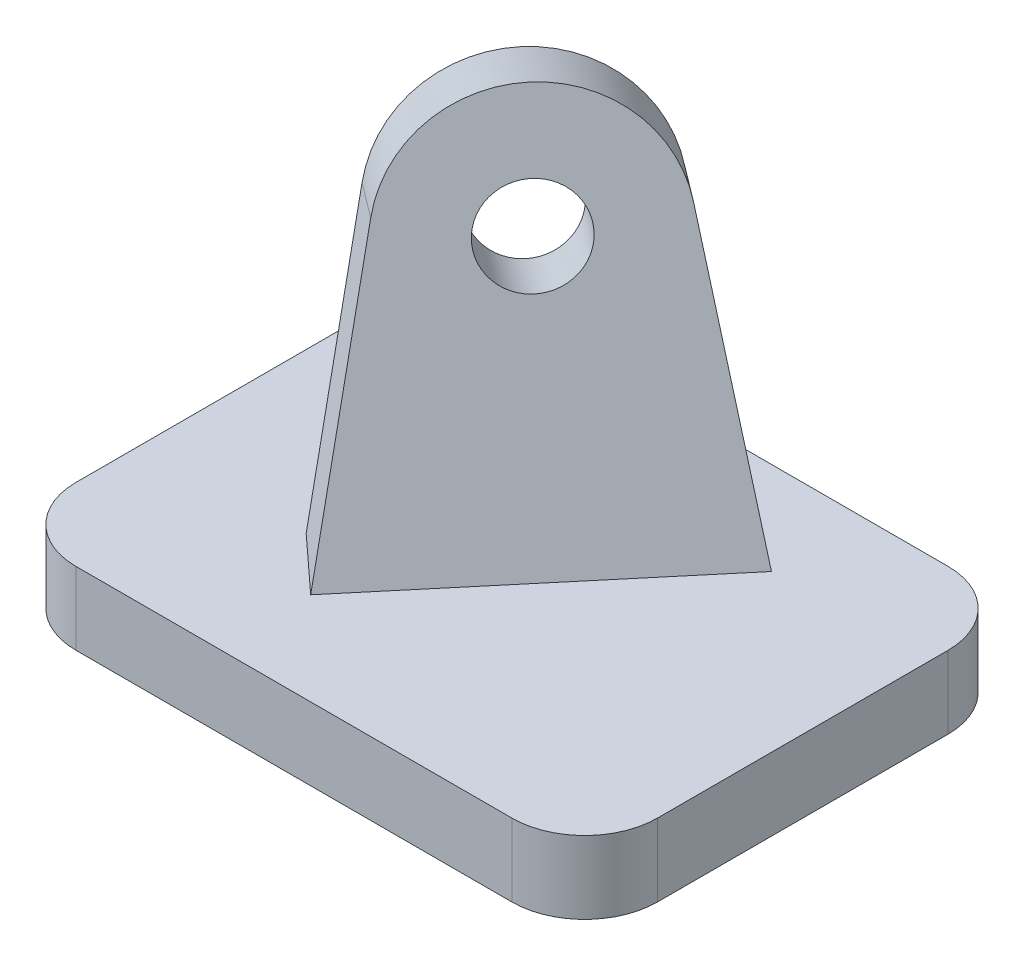
ISO-10303-21;
HEADER;
FILE_DESCRIPTION(('STEP AP214'),'2;1');
FILE_NAME('part.step','',(''),(''),'','','');
FILE_SCHEMA(('AUTOMOTIVE_DESIGN { 1 0 10303 214 1 1 1 1 }'));
ENDSEC;
DATA;
#1=APPLICATION_CONTEXT('core data for automotive mechanical design processes');
#2=APPLICATION_PROTOCOL_DEFINITION('international standard','automotive_design',2000,#1);
#3=PRODUCT_CONTEXT('',#1,'mechanical');
#4=PRODUCT('Part','Part','',(#3));
#5=PRODUCT_RELATED_PRODUCT_CATEGORY('part','',(#4));
#6=PRODUCT_DEFINITION_FORMATION('','',#4);
#7=PRODUCT_DEFINITION_CONTEXT('part definition',#1,'design');
#8=PRODUCT_DEFINITION('design','',#6,#7);
#9=PRODUCT_DEFINITION_SHAPE('','',#8);
#10=(LENGTH_UNIT() NAMED_UNIT(*) SI_UNIT(.MILLI.,.METRE.));
#11=(NAMED_UNIT(*) PLANE_ANGLE_UNIT() SI_UNIT($,.RADIAN.));
#12=(NAMED_UNIT(*) SI_UNIT($,.STERADIAN.) SOLID_ANGLE_UNIT());
#13=UNCERTAINTY_MEASURE_WITH_UNIT(LENGTH_MEASURE(1.E-05),#10,'distance_accuracy_value','');
#14=(GEOMETRIC_REPRESENTATION_CONTEXT(3) GLOBAL_UNCERTAINTY_ASSIGNED_CONTEXT((#13)) GLOBAL_UNIT_ASSIGNED_CONTEXT((#10,
#11,#12)) REPRESENTATION_CONTEXT('',''));
#15=CARTESIAN_POINT('',(0.,0.,0.));
#16=DIRECTION('',(0.,0.,1.));
#17=DIRECTION('',(1.,0.,0.));
#18=AXIS2_PLACEMENT_3D('',#15,#16,#17);
#19=CARTESIAN_POINT('',(30.,10.,-20.));
#20=DIRECTION('',(0.,-1.,0.));
#21=DIRECTION('',(0.,0.,-1.));
#22=AXIS2_PLACEMENT_3D('',#19,#20,#21);
#23=CYLINDRICAL_SURFACE('',#22,10.);
#24=CARTESIAN_POINT('',(30.,0.,-20.));
#25=DIRECTION('',(0.,1.,0.));
#26=DIRECTION('',(0.,0.,-1.));
#27=AXIS2_PLACEMENT_3D('',#24,#25,#26);
#28=CIRCLE('',#27,10.);
#29=CARTESIAN_POINT('',(40.,0.,-19.9999999999999));
#30=VERTEX_POINT('',#29);
#31=CARTESIAN_POINT('',(29.9999999999999,0.,-30.));
#32=VERTEX_POINT('',#31);
#33=EDGE_CURVE('E159',#30,#32,#28,.T.);
#34=ORIENTED_EDGE('',*,*,#33,.T.);
#35=DIRECTION('',(0.,-1.,0.));
#36=VECTOR('',#35,1.);
#37=CARTESIAN_POINT('',(29.9999999999999,10.,-30.));
#38=LINE('',#37,#36);
#39=CARTESIAN_POINT('',(29.9999999999999,10.,-30.));
#40=VERTEX_POINT('',#39);
#41=EDGE_CURVE('E215',#40,#32,#38,.T.);
#42=ORIENTED_EDGE('',*,*,#41,.F.);
#43=CARTESIAN_POINT('',(30.,10.,-20.));
#44=DIRECTION('',(0.,1.,0.));
#45=DIRECTION('',(0.,0.,-1.));
#46=AXIS2_PLACEMENT_3D('',#43,#44,#45);
#47=CIRCLE('',#46,10.);
#48=CARTESIAN_POINT('',(40.,10.,-19.9999999999999));
#49=VERTEX_POINT('',#48);
#50=EDGE_CURVE('E161',#49,#40,#47,.T.);
#51=ORIENTED_EDGE('',*,*,#50,.F.);
#52=DIRECTION('',(0.,-1.,0.));
#53=VECTOR('',#52,1.);
#54=CARTESIAN_POINT('',(40.,10.,-19.9999999999999));
#55=LINE('',#54,#53);
#56=EDGE_CURVE('E179',#49,#30,#55,.T.);
#57=ORIENTED_EDGE('',*,*,#56,.T.);
#58=EDGE_LOOP('',(#34,#42,#51,#57));
#59=FACE_BOUND('',#58,.T.);
#60=ADVANCED_FACE('F41',(#59),#23,.T.);
#61=CARTESIAN_POINT('',(-29.9999999999999,10.,-30.));
#62=DIRECTION('',(0.,0.,1.));
#63=DIRECTION('',(1.,0.,0.));
#64=AXIS2_PLACEMENT_3D('',#61,#62,#63);
#65=PLANE('',#64);
#66=DIRECTION('',(-1.,0.,0.));
#67=VECTOR('',#66,1.);
#68=CARTESIAN_POINT('',(-29.9999999999999,0.,-30.));
#69=LINE('',#68,#67);
#70=CARTESIAN_POINT('',(-29.9999999999999,0.,-30.));
#71=VERTEX_POINT('',#70);
#72=EDGE_CURVE('E182',#32,#71,#69,.T.);
#73=ORIENTED_EDGE('',*,*,#72,.T.);
#74=DIRECTION('',(0.,-1.,0.));
#75=VECTOR('',#74,1.);
#76=CARTESIAN_POINT('',(-29.9999999999999,10.,-30.));
#77=LINE('',#76,#75);
#78=CARTESIAN_POINT('',(-29.9999999999999,10.,-30.));
#79=VERTEX_POINT('',#78);
#80=EDGE_CURVE('E212',#79,#71,#77,.T.);
#81=ORIENTED_EDGE('',*,*,#80,.F.);
#82=DIRECTION('',(-1.,0.,0.));
#83=VECTOR('',#82,1.);
#84=CARTESIAN_POINT('',(-29.9999999999999,10.,-30.));
#85=LINE('',#84,#83);
#86=EDGE_CURVE('E164',#40,#79,#85,.T.);
#87=ORIENTED_EDGE('',*,*,#86,.F.);
#88=ORIENTED_EDGE('',*,*,#41,.T.);
#89=EDGE_LOOP('',(#73,#81,#87,#88));
#90=FACE_BOUND('',#89,.T.);
#91=ADVANCED_FACE('F247',(#90),#65,.F.);
#92=CARTESIAN_POINT('',(-30.,10.,-20.));
#93=DIRECTION('',(0.,-1.,0.));
#94=DIRECTION('',(0.,0.,-1.));
#95=AXIS2_PLACEMENT_3D('',#92,#93,#94);
#96=CYLINDRICAL_SURFACE('',#95,10.);
#97=CARTESIAN_POINT('',(-30.,0.,-20.));
#98=DIRECTION('',(0.,1.,0.));
#99=DIRECTION('',(0.,0.,1.));
#100=AXIS2_PLACEMENT_3D('',#97,#98,#99);
#101=CIRCLE('',#100,10.);
#102=CARTESIAN_POINT('',(-40.,0.,-19.9999999999999));
#103=VERTEX_POINT('',#102);
#104=EDGE_CURVE('E184',#71,#103,#101,.T.);
#105=ORIENTED_EDGE('',*,*,#104,.T.);
#106=DIRECTION('',(0.,-1.,0.));
#107=VECTOR('',#106,1.);
#108=CARTESIAN_POINT('',(-40.,10.,-19.9999999999999));
#109=LINE('',#108,#107);
#110=CARTESIAN_POINT('',(-40.,10.,-19.9999999999999));
#111=VERTEX_POINT('',#110);
#112=EDGE_CURVE('E209',#111,#103,#109,.T.);
#113=ORIENTED_EDGE('',*,*,#112,.F.);
#114=CARTESIAN_POINT('',(-30.,10.,-20.));
#115=DIRECTION('',(0.,1.,0.));
#116=DIRECTION('',(0.,0.,1.));
#117=AXIS2_PLACEMENT_3D('',#114,#115,#116);
#118=CIRCLE('',#117,10.);
#119=EDGE_CURVE('E167',#79,#111,#118,.T.);
#120=ORIENTED_EDGE('',*,*,#119,.F.);
#121=ORIENTED_EDGE('',*,*,#80,.T.);
#122=EDGE_LOOP('',(#105,#113,#120,#121));
#123=FACE_BOUND('',#122,.T.);
#124=ADVANCED_FACE('F252',(#123),#96,.T.);
#125=CARTESIAN_POINT('',(-40.,10.,-19.9999999999999));
#126=DIRECTION('',(1.,0.,0.));
#127=DIRECTION('',(0.,0.,-1.));
#128=AXIS2_PLACEMENT_3D('',#125,#126,#127);
#129=PLANE('',#128);
#130=DIRECTION('',(0.,0.,1.));
#131=VECTOR('',#130,1.);
#132=CARTESIAN_POINT('',(-40.,0.,-19.9999999999999));
#133=LINE('',#132,#131);
#134=CARTESIAN_POINT('',(-40.,0.,19.9999999999999));
#135=VERTEX_POINT('',#134);
#136=EDGE_CURVE('E186',#103,#135,#133,.T.);
#137=ORIENTED_EDGE('',*,*,#136,.T.);
#138=DIRECTION('',(0.,-1.,0.));
#139=VECTOR('',#138,1.);
#140=CARTESIAN_POINT('',(-40.,10.,19.9999999999999));
#141=LINE('',#140,#139);
#142=CARTESIAN_POINT('',(-40.,10.,19.9999999999999));
#143=VERTEX_POINT('',#142);
#144=EDGE_CURVE('E206',#143,#135,#141,.T.);
#145=ORIENTED_EDGE('',*,*,#144,.F.);
#146=DIRECTION('',(0.,0.,1.));
#147=VECTOR('',#146,1.);
#148=CARTESIAN_POINT('',(-40.,10.,-19.9999999999999));
#149=LINE('',#148,#147);
#150=EDGE_CURVE('E169',#111,#143,#149,.T.);
#151=ORIENTED_EDGE('',*,*,#150,.F.);
#152=ORIENTED_EDGE('',*,*,#112,.T.);
#153=EDGE_LOOP('',(#137,#145,#151,#152));
#154=FACE_BOUND('',#153,.T.);
#155=ADVANCED_FACE('F286',(#154),#129,.F.);
#156=CARTESIAN_POINT('',(-30.,10.,20.));
#157=DIRECTION('',(0.,-1.,0.));
#158=DIRECTION('',(0.,0.,-1.));
#159=AXIS2_PLACEMENT_3D('',#156,#157,#158);
#160=CYLINDRICAL_SURFACE('',#159,10.);
#161=CARTESIAN_POINT('',(-30.,0.,20.));
#162=DIRECTION('',(0.,1.,0.));
#163=DIRECTION('',(0.,0.,1.));
#164=AXIS2_PLACEMENT_3D('',#161,#162,#163);
#165=CIRCLE('',#164,10.);
#166=CARTESIAN_POINT('',(-30.,0.,30.));
#167=VERTEX_POINT('',#166);
#168=EDGE_CURVE('E188',#135,#167,#165,.T.);
#169=ORIENTED_EDGE('',*,*,#168,.T.);
#170=DIRECTION('',(0.,-1.,0.));
#171=VECTOR('',#170,1.);
#172=CARTESIAN_POINT('',(-30.,10.,30.));
#173=LINE('',#172,#171);
#174=CARTESIAN_POINT('',(-30.,10.,30.));
#175=VERTEX_POINT('',#174);
#176=EDGE_CURVE('E203',#175,#167,#173,.T.);
#177=ORIENTED_EDGE('',*,*,#176,.F.);
#178=CARTESIAN_POINT('',(-30.,10.,20.));
#179=DIRECTION('',(0.,1.,0.));
#180=DIRECTION('',(0.,0.,1.));
#181=AXIS2_PLACEMENT_3D('',#178,#179,#180);
#182=CIRCLE('',#181,10.);
#183=EDGE_CURVE('E171',#143,#175,#182,.T.);
#184=ORIENTED_EDGE('',*,*,#183,.F.);
#185=ORIENTED_EDGE('',*,*,#144,.T.);
#186=EDGE_LOOP('',(#169,#177,#184,#185));
#187=FACE_BOUND('',#186,.T.);
#188=ADVANCED_FACE('F282',(#187),#160,.T.);
#189=CARTESIAN_POINT('',(-29.9999999999999,10.,30.));
#190=DIRECTION('',(0.,0.,-1.));
#191=DIRECTION('',(-1.,0.,0.));
#192=AXIS2_PLACEMENT_3D('',#189,#190,#191);
#193=PLANE('',#192);
#194=DIRECTION('',(1.,0.,0.));
#195=VECTOR('',#194,1.);
#196=CARTESIAN_POINT('',(-29.9999999999999,0.,30.));
#197=LINE('',#196,#195);
#198=CARTESIAN_POINT('',(29.9999999999999,0.,30.));
#199=VERTEX_POINT('',#198);
#200=EDGE_CURVE('E190',#167,#199,#197,.T.);
#201=ORIENTED_EDGE('',*,*,#200,.T.);
#202=DIRECTION('',(0.,-1.,0.));
#203=VECTOR('',#202,1.);
#204=CARTESIAN_POINT('',(29.9999999999999,10.,30.));
#205=LINE('',#204,#203);
#206=CARTESIAN_POINT('',(29.9999999999999,10.,30.));
#207=VERTEX_POINT('',#206);
#208=EDGE_CURVE('E200',#207,#199,#205,.T.);
#209=ORIENTED_EDGE('',*,*,#208,.F.);
#210=DIRECTION('',(1.,0.,0.));
#211=VECTOR('',#210,1.);
#212=CARTESIAN_POINT('',(-29.9999999999999,10.,30.));
#213=LINE('',#212,#211);
#214=EDGE_CURVE('E173',#175,#207,#213,.T.);
#215=ORIENTED_EDGE('',*,*,#214,.F.);
#216=ORIENTED_EDGE('',*,*,#176,.T.);
#217=EDGE_LOOP('',(#201,#209,#215,#216));
#218=FACE_BOUND('',#217,.T.);
#219=ADVANCED_FACE('F277',(#218),#193,.F.);
#220=CARTESIAN_POINT('',(30.,10.,20.));
#221=DIRECTION('',(0.,-1.,0.));
#222=DIRECTION('',(0.,0.,-1.));
#223=AXIS2_PLACEMENT_3D('',#220,#221,#222);
#224=CYLINDRICAL_SURFACE('',#223,10.);
#225=CARTESIAN_POINT('',(30.,0.,20.));
#226=DIRECTION('',(0.,1.,0.));
#227=DIRECTION('',(0.,0.,1.));
#228=AXIS2_PLACEMENT_3D('',#225,#226,#227);
#229=CIRCLE('',#228,10.);
#230=CARTESIAN_POINT('',(40.,0.,19.9999999999999));
#231=VERTEX_POINT('',#230);
#232=EDGE_CURVE('E192',#199,#231,#229,.T.);
#233=ORIENTED_EDGE('',*,*,#232,.T.);
#234=DIRECTION('',(0.,-1.,0.));
#235=VECTOR('',#234,1.);
#236=CARTESIAN_POINT('',(40.,10.,19.9999999999999));
#237=LINE('',#236,#235);
#238=CARTESIAN_POINT('',(40.,10.,19.9999999999999));
#239=VERTEX_POINT('',#238);
#240=EDGE_CURVE('E197',#239,#231,#237,.T.);
#241=ORIENTED_EDGE('',*,*,#240,.F.);
#242=CARTESIAN_POINT('',(30.,10.,20.));
#243=DIRECTION('',(0.,1.,0.));
#244=DIRECTION('',(0.,0.,1.));
#245=AXIS2_PLACEMENT_3D('',#242,#243,#244);
#246=CIRCLE('',#245,10.);
#247=EDGE_CURVE('E175',#207,#239,#246,.T.);
#248=ORIENTED_EDGE('',*,*,#247,.F.);
#249=ORIENTED_EDGE('',*,*,#208,.T.);
#250=EDGE_LOOP('',(#233,#241,#248,#249));
#251=FACE_BOUND('',#250,.T.);
#252=ADVANCED_FACE('F272',(#251),#224,.T.);
#253=CARTESIAN_POINT('',(40.,10.,-19.9999999999999));
#254=DIRECTION('',(-1.,0.,0.));
#255=DIRECTION('',(0.,0.,1.));
#256=AXIS2_PLACEMENT_3D('',#253,#254,#255);
#257=PLANE('',#256);
#258=DIRECTION('',(0.,0.,-1.));
#259=VECTOR('',#258,1.);
#260=CARTESIAN_POINT('',(40.,0.,-19.9999999999999));
#261=LINE('',#260,#259);
#262=EDGE_CURVE('E165',#231,#30,#261,.T.);
#263=ORIENTED_EDGE('',*,*,#262,.T.);
#264=ORIENTED_EDGE('',*,*,#56,.F.);
#265=DIRECTION('',(0.,0.,-1.));
#266=VECTOR('',#265,1.);
#267=CARTESIAN_POINT('',(40.,10.,-19.9999999999999));
#268=LINE('',#267,#266);
#269=EDGE_CURVE('E177',#239,#49,#268,.T.);
#270=ORIENTED_EDGE('',*,*,#269,.F.);
#271=ORIENTED_EDGE('',*,*,#240,.T.);
#272=EDGE_LOOP('',(#263,#264,#270,#271));
#273=FACE_BOUND('',#272,.T.);
#274=ADVANCED_FACE('F270',(#273),#257,.F.);
#275=CARTESIAN_POINT('',(30.,10.,-20.));
#276=DIRECTION('',(0.,-1.,0.));
#277=DIRECTION('',(0.,0.,-1.));
#278=AXIS2_PLACEMENT_3D('',#275,#276,#277);
#279=PLANE('',#278);
#280=DIRECTION('',(-0.736370351590274,0.,-0.676578676355394));
#281=VECTOR('',#280,1.);
#282=CARTESIAN_POINT('',(-7.07360268558704,10.,20.3499294292919));
#283=LINE('',#282,#281);
#284=CARTESIAN_POINT('',(-10.4627212179471,10.,17.235999970177));
#285=VERTEX_POINT('',#284);
#286=CARTESIAN_POINT('',(-18.093904674085,10.,10.2244520573249));
#287=VERTEX_POINT('',#286);
#288=EDGE_CURVE('E48',#285,#287,#283,.T.);
#289=ORIENTED_EDGE('',*,*,#288,.T.);
#290=DIRECTION('',(0.642787609686538,0.,-0.76604444311898));
#291=VECTOR('',#290,1.);
#292=CARTESIAN_POINT('',(16.6599755694861,10.,-31.1936095795401));
#293=LINE('',#292,#291);
#294=CARTESIAN_POINT('',(10.2325533721533,10.,-23.533706084749));
#295=VERTEX_POINT('',#294);
#296=EDGE_CURVE('E11',#287,#295,#293,.T.);
#297=ORIENTED_EDGE('',*,*,#296,.T.);
#298=DIRECTION('',(0.79416929563914,0.,0.607696577137005));
#299=VECTOR('',#298,1.);
#300=CARTESIAN_POINT('',(24.4053941268096,10.,-12.6886798891933));
#301=LINE('',#300,#299);
#302=CARTESIAN_POINT('',(18.4627212179471,10.,-17.235999970177));
#303=VERTEX_POINT('',#302);
#304=EDGE_CURVE('E129',#295,#303,#301,.T.);
#305=ORIENTED_EDGE('',*,*,#304,.T.);
#306=DIRECTION('',(0.642787609686538,0.,-0.766044443118979));
#307=VECTOR('',#306,1.);
#308=CARTESIAN_POINT('',(-10.4627212179471,10.,17.235999970177));
#309=LINE('',#308,#307);
#310=EDGE_CURVE('E152',#285,#303,#309,.T.);
#311=ORIENTED_EDGE('',*,*,#310,.F.);
#312=EDGE_LOOP('',(#289,#297,#305,#311));
#313=FACE_BOUND('',#312,.T.);
#314=ORIENTED_EDGE('',*,*,#50,.T.);
#315=ORIENTED_EDGE('',*,*,#86,.T.);
#316=ORIENTED_EDGE('',*,*,#119,.T.);
#317=ORIENTED_EDGE('',*,*,#150,.T.);
#318=ORIENTED_EDGE('',*,*,#183,.T.);
#319=ORIENTED_EDGE('',*,*,#214,.T.);
#320=ORIENTED_EDGE('',*,*,#247,.T.);
#321=ORIENTED_EDGE('',*,*,#269,.T.);
#322=EDGE_LOOP('',(#314,#315,#316,#317,#318,#319,#320,#321));
#323=FACE_BOUND('',#322,.T.);
#324=ADVANCED_FACE('F218',(#313,#323),#279,.F.);
#325=CARTESIAN_POINT('',(30.,0.,-20.));
#326=DIRECTION('',(0.,-1.,0.));
#327=DIRECTION('',(0.,0.,-1.));
#328=AXIS2_PLACEMENT_3D('',#325,#326,#327);
#329=PLANE('',#328);
#330=ORIENTED_EDGE('',*,*,#33,.F.);
#331=ORIENTED_EDGE('',*,*,#262,.F.);
#332=ORIENTED_EDGE('',*,*,#232,.F.);
#333=ORIENTED_EDGE('',*,*,#200,.F.);
#334=ORIENTED_EDGE('',*,*,#168,.F.);
#335=ORIENTED_EDGE('',*,*,#136,.F.);
#336=ORIENTED_EDGE('',*,*,#104,.F.);
#337=ORIENTED_EDGE('',*,*,#72,.F.);
#338=EDGE_LOOP('',(#330,#331,#332,#333,#334,#335,#336,#337));
#339=FACE_BOUND('',#338,.T.);
#340=ADVANCED_FACE('F260',(#339),#329,.T.);
#341=CARTESIAN_POINT('',(-17.8621423348856,7.41180954897482,11.0271484400286));
#342=DIRECTION('',(-0.667250985509113,0.165478233900366,0.726218339373451));
#343=DIRECTION('',(0.736370351590274,0.,0.676578676355394));
#344=AXIS2_PLACEMENT_3D('',#341,#342,#343);
#345=PLANE('',#344);
#346=ORIENTED_EDGE('',*,*,#288,.F.);
#347=DIRECTION('',(0.0852161585567179,-0.951645761823924,0.295141576744788));
#348=VECTOR('',#347,1.);
#349=CARTESIAN_POINT('',(-10.4627212179471,10.,17.235999970177));
#350=LINE('',#349,#348);
#351=CARTESIAN_POINT('',(-13.813623854015,47.4209814888123,5.63032911763443));
#352=VERTEX_POINT('',#351);
#353=EDGE_CURVE('E149',#352,#285,#350,.T.);
#354=ORIENTED_EDGE('',*,*,#353,.F.);
#355=DIRECTION('',(0.73994211169385,0.258819045102518,0.620885153014844));
#356=VECTOR('',#355,1.);
#357=CARTESIAN_POINT('',(-21.2130449709535,44.8327910377872,-0.578522412514017));
#358=LINE('',#357,#356);
#359=CARTESIAN_POINT('',(-21.2130449709535,44.8327910377872,-0.578522412514017));
#360=VERTEX_POINT('',#359);
#361=EDGE_CURVE('E141',#360,#352,#358,.T.);
#362=ORIENTED_EDGE('',*,*,#361,.F.);
#363=DIRECTION('',(0.0852161585567179,-0.951645761823924,0.295141576744788));
#364=VECTOR('',#363,1.);
#365=CARTESIAN_POINT('',(-17.8621423348856,7.41180954897482,11.0271484400286));
#366=LINE('',#365,#364);
#367=EDGE_CURVE('E133',#360,#287,#366,.T.);
#368=ORIENTED_EDGE('',*,*,#367,.T.);
#369=EDGE_LOOP('',(#346,#354,#362,#368));
#370=FACE_BOUND('',#369,.T.);
#371=ADVANCED_FACE('F224',(#370),#345,.T.);
#372=CARTESIAN_POINT('',(11.0633001010086,7.41180954897482,-23.4448515003255));
#373=DIRECTION('',(0.599318533314502,0.165478233900366,-0.783220434954918));
#374=DIRECTION('',(-0.79416929563914,0.,-0.607696577137005));
#375=AXIS2_PLACEMENT_3D('',#372,#373,#374);
#376=PLANE('',#375);
#377=ORIENTED_EDGE('',*,*,#304,.F.);
#378=DIRECTION('',(-0.305455343655665,0.951645761823924,-0.0326707366730954));
#379=VECTOR('',#378,1.);
#380=CARTESIAN_POINT('',(11.0633001010086,7.41180954897482,-23.4448515003255));
#381=LINE('',#380,#379);
#382=CARTESIAN_POINT('',(-0.947932669775668,44.8327910377872,-24.7295428017679));
#383=VERTEX_POINT('',#382);
#384=EDGE_CURVE('E123',#295,#383,#381,.T.);
#385=ORIENTED_EDGE('',*,*,#384,.T.);
#386=DIRECTION('',(0.73994211169385,0.258819045102518,0.620885153014844));
#387=VECTOR('',#386,1.);
#388=CARTESIAN_POINT('',(-0.947932669775668,44.8327910377872,-24.7295428017679));
#389=LINE('',#388,#387);
#390=CARTESIAN_POINT('',(6.45148844716283,47.4209814888123,-18.5206912716195));
#391=VERTEX_POINT('',#390);
#392=EDGE_CURVE('E127',#383,#391,#389,.T.);
#393=ORIENTED_EDGE('',*,*,#392,.T.);
#394=DIRECTION('',(-0.305455343655665,0.951645761823924,-0.0326707366730954));
#395=VECTOR('',#394,1.);
#396=CARTESIAN_POINT('',(18.4627212179471,10.,-17.235999970177));
#397=LINE('',#396,#395);
#398=EDGE_CURVE('E156',#303,#391,#397,.T.);
#399=ORIENTED_EDGE('',*,*,#398,.F.);
#400=EDGE_LOOP('',(#377,#385,#393,#399));
#401=FACE_BOUND('',#400,.T.);
#402=ADVANCED_FACE('F125',(#401),#376,.T.);
#403=CARTESIAN_POINT('',(-10.5370292028077,42.1851392953813,-12.1980158424892));
#404=DIRECTION('',(-0.73994211169385,-0.258819045102518,-0.620885153014844));
#405=DIRECTION('',(-0.642787609686538,0.,0.76604444311898));
#406=AXIS2_PLACEMENT_3D('',#403,#404,#405);
#407=PLANE('',#406);
#408=CARTESIAN_POINT('',(-10.5370292028077,42.1851392953813,-12.1980158424892));
#409=DIRECTION('',(0.73994211169385,0.258819045102518,0.620885153014844));
#410=DIRECTION('',(0.642787609686538,0.,-0.76604444311898));
#411=AXIS2_PLACEMENT_3D('',#408,#409,#410);
#412=CIRCLE('',#411,6.);
#413=CARTESIAN_POINT('',(-6.68030354468846,42.1851392953813,-16.7942825012031));
#414=VERTEX_POINT('',#413);
#415=EDGE_CURVE('E153',#414,#414,#412,.T.);
#416=ORIENTED_EDGE('',*,*,#415,.T.);
#417=EDGE_LOOP('',(#416));
#418=FACE_BOUND('',#417,.T.);
#419=ORIENTED_EDGE('',*,*,#296,.F.);
#420=ORIENTED_EDGE('',*,*,#367,.F.);
#421=CARTESIAN_POINT('',(-10.5370292028077,42.1851392953813,-12.1980158424892));
#422=DIRECTION('',(0.73994211169385,0.258819045102518,0.620885153014844));
#423=DIRECTION('',(-0.642787609686538,0.,0.76604444311898));
#424=AXIS2_PLACEMENT_3D('',#421,#422,#423);
#425=CIRCLE('',#424,16.);
#426=EDGE_CURVE('E132',#383,#360,#425,.T.);
#427=ORIENTED_EDGE('',*,*,#426,.F.);
#428=ORIENTED_EDGE('',*,*,#384,.F.);
#429=EDGE_LOOP('',(#419,#420,#427,#428));
#430=FACE_BOUND('',#429,.T.);
#431=ADVANCED_FACE('F144',(#418,#430),#407,.T.);
#432=CARTESIAN_POINT('',(-10.5370292028077,42.1851392953813,-12.1980158424892));
#433=DIRECTION('',(0.73994211169385,0.258819045102518,0.620885153014844));
#434=DIRECTION('',(0.642787609686538,0.,-0.76604444311898));
#435=AXIS2_PLACEMENT_3D('',#432,#433,#434);
#436=CYLINDRICAL_SURFACE('',#435,16.);
#437=CARTESIAN_POINT('',(-3.13760808586919,44.7733297464065,-5.98916431234079));
#438=DIRECTION('',(0.73994211169385,0.258819045102518,0.620885153014844));
#439=DIRECTION('',(-0.642787609686538,0.,0.76604444311898));
#440=AXIS2_PLACEMENT_3D('',#437,#438,#439);
#441=CIRCLE('',#440,16.);
#442=EDGE_CURVE('E140',#391,#352,#441,.T.);
#443=ORIENTED_EDGE('',*,*,#442,.F.);
#444=ORIENTED_EDGE('',*,*,#392,.F.);
#445=ORIENTED_EDGE('',*,*,#426,.T.);
#446=ORIENTED_EDGE('',*,*,#361,.T.);
#447=EDGE_LOOP('',(#443,#444,#445,#446));
#448=FACE_BOUND('',#447,.T.);
#449=ADVANCED_FACE('F138',(#448),#436,.T.);
#450=CARTESIAN_POINT('',(-3.13760808586919,44.7733297464065,-5.98916431234079));
#451=DIRECTION('',(-0.73994211169385,-0.258819045102518,-0.620885153014844));
#452=DIRECTION('',(-0.642787609686538,0.,0.76604444311898));
#453=AXIS2_PLACEMENT_3D('',#450,#451,#452);
#454=PLANE('',#453);
#455=CARTESIAN_POINT('',(-3.13760808586919,44.7733297464065,-5.98916431234079));
#456=DIRECTION('',(0.73994211169385,0.258819045102518,0.620885153014844));
#457=DIRECTION('',(0.642787609686538,0.,-0.76604444311898));
#458=AXIS2_PLACEMENT_3D('',#455,#456,#457);
#459=CIRCLE('',#458,6.);
#460=CARTESIAN_POINT('',(0.719117572250038,44.7733297464065,-10.5854309710547));
#461=VERTEX_POINT('',#460);
#462=EDGE_CURVE('E226',#461,#461,#459,.T.);
#463=ORIENTED_EDGE('',*,*,#462,.F.);
#464=EDGE_LOOP('',(#463));
#465=FACE_BOUND('',#464,.T.);
#466=ORIENTED_EDGE('',*,*,#353,.T.);
#467=ORIENTED_EDGE('',*,*,#310,.T.);
#468=ORIENTED_EDGE('',*,*,#398,.T.);
#469=ORIENTED_EDGE('',*,*,#442,.T.);
#470=EDGE_LOOP('',(#466,#467,#468,#469));
#471=FACE_BOUND('',#470,.T.);
#472=ADVANCED_FACE('F221',(#465,#471),#454,.F.);
#473=CARTESIAN_POINT('',(-10.5370292028077,42.1851392953813,-12.1980158424892));
#474=DIRECTION('',(0.73994211169385,0.258819045102518,0.620885153014844));
#475=DIRECTION('',(0.642787609686538,0.,-0.76604444311898));
#476=AXIS2_PLACEMENT_3D('',#473,#474,#475);
#477=CYLINDRICAL_SURFACE('',#476,6.);
#478=ORIENTED_EDGE('',*,*,#415,.F.);
#479=EDGE_LOOP('',(#478));
#480=FACE_BOUND('',#479,.T.);
#481=ORIENTED_EDGE('',*,*,#462,.T.);
#482=EDGE_LOOP('',(#481));
#483=FACE_BOUND('',#482,.T.);
#484=ADVANCED_FACE('F233',(#480,#483),#477,.F.);
#485=CLOSED_SHELL('',(#60,#91,#124,#155,#188,#219,#252,#274,#324,#340,#371,#402,#431,#449,#472,#484));
#486=MANIFOLD_SOLID_BREP('B2',#485);
#487=ADVANCED_BREP_SHAPE_REPRESENTATION('',(#18,#486),#14);
#488=SHAPE_DEFINITION_REPRESENTATION(#9,#487);
ENDSEC;
END-ISO-10303-21;
